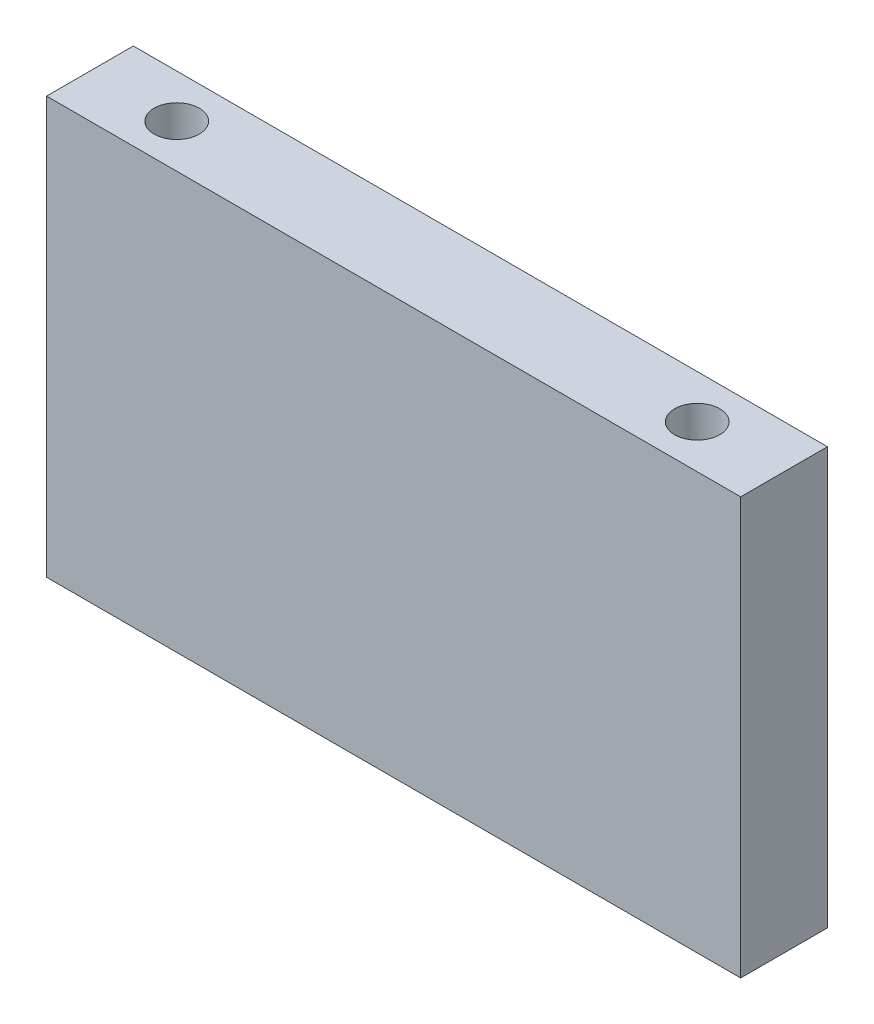
ISO-10303-21;
HEADER;
FILE_DESCRIPTION(('STEP AP214'),'2;1');
FILE_NAME('part.step','',(''),(''),'','','');
FILE_SCHEMA(('AUTOMOTIVE_DESIGN { 1 0 10303 214 1 1 1 1 }'));
ENDSEC;
DATA;
#1=APPLICATION_CONTEXT('core data for automotive mechanical design processes');
#2=APPLICATION_PROTOCOL_DEFINITION('international standard','automotive_design',2000,#1);
#3=PRODUCT_CONTEXT('',#1,'mechanical');
#4=PRODUCT('Part','Part','',(#3));
#5=PRODUCT_RELATED_PRODUCT_CATEGORY('part','',(#4));
#6=PRODUCT_DEFINITION_FORMATION('','',#4);
#7=PRODUCT_DEFINITION_CONTEXT('part definition',#1,'design');
#8=PRODUCT_DEFINITION('design','',#6,#7);
#9=PRODUCT_DEFINITION_SHAPE('','',#8);
#10=(LENGTH_UNIT() NAMED_UNIT(*) SI_UNIT(.MILLI.,.METRE.));
#11=(NAMED_UNIT(*) PLANE_ANGLE_UNIT() SI_UNIT($,.RADIAN.));
#12=(NAMED_UNIT(*) SI_UNIT($,.STERADIAN.) SOLID_ANGLE_UNIT());
#13=UNCERTAINTY_MEASURE_WITH_UNIT(LENGTH_MEASURE(1.E-05),#10,'distance_accuracy_value','');
#14=(GEOMETRIC_REPRESENTATION_CONTEXT(3) GLOBAL_UNCERTAINTY_ASSIGNED_CONTEXT((#13)) GLOBAL_UNIT_ASSIGNED_CONTEXT((#10,
#11,#12)) REPRESENTATION_CONTEXT('',''));
#15=CARTESIAN_POINT('',(0.,0.,0.));
#16=DIRECTION('',(0.,0.,1.));
#17=DIRECTION('',(1.,0.,0.));
#18=AXIS2_PLACEMENT_3D('',#15,#16,#17);
#19=CARTESIAN_POINT('',(0.,0.,6.35));
#20=DIRECTION('',(1.,0.,0.));
#21=DIRECTION('',(0.,0.,-1.));
#22=AXIS2_PLACEMENT_3D('',#19,#20,#21);
#23=PLANE('',#22);
#24=DIRECTION('',(0.,-1.,0.));
#25=VECTOR('',#24,1.);
#26=CARTESIAN_POINT('',(0.,0.,0.));
#27=LINE('',#26,#25);
#28=CARTESIAN_POINT('',(0.,30.5,0.));
#29=VERTEX_POINT('',#28);
#30=CARTESIAN_POINT('',(0.,0.,0.));
#31=VERTEX_POINT('',#30);
#32=EDGE_CURVE('E98',#29,#31,#27,.T.);
#33=ORIENTED_EDGE('',*,*,#32,.T.);
#34=DIRECTION('',(0.,0.,-1.));
#35=VECTOR('',#34,1.);
#36=CARTESIAN_POINT('',(0.,0.,6.35));
#37=LINE('',#36,#35);
#38=CARTESIAN_POINT('',(0.,0.,6.35));
#39=VERTEX_POINT('',#38);
#40=EDGE_CURVE('E11',#39,#31,#37,.T.);
#41=ORIENTED_EDGE('',*,*,#40,.F.);
#42=DIRECTION('',(0.,-1.,0.));
#43=VECTOR('',#42,1.);
#44=CARTESIAN_POINT('',(0.,0.,6.35));
#45=LINE('',#44,#43);
#46=CARTESIAN_POINT('',(0.,30.5,6.35));
#47=VERTEX_POINT('',#46);
#48=EDGE_CURVE('E86',#47,#39,#45,.T.);
#49=ORIENTED_EDGE('',*,*,#48,.F.);
#50=DIRECTION('',(0.,0.,-1.));
#51=VECTOR('',#50,1.);
#52=CARTESIAN_POINT('',(0.,30.5,6.35));
#53=LINE('',#52,#51);
#54=EDGE_CURVE('E94',#47,#29,#53,.T.);
#55=ORIENTED_EDGE('',*,*,#54,.T.);
#56=EDGE_LOOP('',(#33,#41,#49,#55));
#57=FACE_BOUND('',#56,.T.);
#58=ADVANCED_FACE('F35',(#57),#23,.F.);
#59=CARTESIAN_POINT('',(0.,0.,6.35));
#60=DIRECTION('',(0.,1.,0.));
#61=DIRECTION('',(0.,0.,1.));
#62=AXIS2_PLACEMENT_3D('',#59,#60,#61);
#63=PLANE('',#62);
#64=CARTESIAN_POINT('',(6.35,0.,3.175));
#65=DIRECTION('',(0.,1.,0.));
#66=DIRECTION('',(0.,0.,1.));
#67=AXIS2_PLACEMENT_3D('',#64,#65,#66);
#68=CIRCLE('',#67,1.65);
#69=CARTESIAN_POINT('',(6.35,0.,4.82499999999999));
#70=VERTEX_POINT('',#69);
#71=EDGE_CURVE('E117',#70,#70,#68,.T.);
#72=ORIENTED_EDGE('',*,*,#71,.T.);
#73=EDGE_LOOP('',(#72));
#74=FACE_BOUND('',#73,.T.);
#75=CARTESIAN_POINT('',(44.449999381277,0.,3.18186634489615));
#76=DIRECTION('',(0.,1.,0.));
#77=DIRECTION('',(0.,0.,1.));
#78=AXIS2_PLACEMENT_3D('',#75,#76,#77);
#79=CIRCLE('',#78,1.64999999999999);
#80=CARTESIAN_POINT('',(44.449999381277,0.,4.83186634489615));
#81=VERTEX_POINT('',#80);
#82=EDGE_CURVE('E101',#81,#81,#79,.T.);
#83=ORIENTED_EDGE('',*,*,#82,.T.);
#84=EDGE_LOOP('',(#83));
#85=FACE_BOUND('',#84,.T.);
#86=DIRECTION('',(1.,0.,0.));
#87=VECTOR('',#86,1.);
#88=CARTESIAN_POINT('',(0.,0.,0.));
#89=LINE('',#88,#87);
#90=CARTESIAN_POINT('',(50.8,0.,0.));
#91=VERTEX_POINT('',#90);
#92=EDGE_CURVE('E90',#31,#91,#89,.T.);
#93=ORIENTED_EDGE('',*,*,#92,.T.);
#94=DIRECTION('',(0.,0.,-1.));
#95=VECTOR('',#94,1.);
#96=CARTESIAN_POINT('',(50.8,0.,6.35));
#97=LINE('',#96,#95);
#98=CARTESIAN_POINT('',(50.8,0.,6.35));
#99=VERTEX_POINT('',#98);
#100=EDGE_CURVE('E43',#99,#91,#97,.T.);
#101=ORIENTED_EDGE('',*,*,#100,.F.);
#102=DIRECTION('',(1.,0.,0.));
#103=VECTOR('',#102,1.);
#104=CARTESIAN_POINT('',(0.,0.,6.35));
#105=LINE('',#104,#103);
#106=EDGE_CURVE('E81',#39,#99,#105,.T.);
#107=ORIENTED_EDGE('',*,*,#106,.F.);
#108=ORIENTED_EDGE('',*,*,#40,.T.);
#109=EDGE_LOOP('',(#93,#101,#107,#108));
#110=FACE_BOUND('',#109,.T.);
#111=ADVANCED_FACE('F89',(#74,#85,#110),#63,.F.);
#112=CARTESIAN_POINT('',(50.8,0.,6.35));
#113=DIRECTION('',(-1.,0.,0.));
#114=DIRECTION('',(0.,0.,1.));
#115=AXIS2_PLACEMENT_3D('',#112,#113,#114);
#116=PLANE('',#115);
#117=DIRECTION('',(0.,1.,0.));
#118=VECTOR('',#117,1.);
#119=CARTESIAN_POINT('',(50.8,0.,0.));
#120=LINE('',#119,#118);
#121=CARTESIAN_POINT('',(50.8,30.5,0.));
#122=VERTEX_POINT('',#121);
#123=EDGE_CURVE('E68',#91,#122,#120,.T.);
#124=ORIENTED_EDGE('',*,*,#123,.T.);
#125=DIRECTION('',(0.,0.,-1.));
#126=VECTOR('',#125,1.);
#127=CARTESIAN_POINT('',(50.8,30.5,6.35));
#128=LINE('',#127,#126);
#129=CARTESIAN_POINT('',(50.8,30.5,6.35));
#130=VERTEX_POINT('',#129);
#131=EDGE_CURVE('E91',#130,#122,#128,.T.);
#132=ORIENTED_EDGE('',*,*,#131,.F.);
#133=DIRECTION('',(0.,1.,0.));
#134=VECTOR('',#133,1.);
#135=CARTESIAN_POINT('',(50.8,0.,6.35));
#136=LINE('',#135,#134);
#137=EDGE_CURVE('E84',#99,#130,#136,.T.);
#138=ORIENTED_EDGE('',*,*,#137,.F.);
#139=ORIENTED_EDGE('',*,*,#100,.T.);
#140=EDGE_LOOP('',(#124,#132,#138,#139));
#141=FACE_BOUND('',#140,.T.);
#142=ADVANCED_FACE('F92',(#141),#116,.F.);
#143=CARTESIAN_POINT('',(0.,30.5,6.35));
#144=DIRECTION('',(0.,-1.,0.));
#145=DIRECTION('',(0.,0.,-1.));
#146=AXIS2_PLACEMENT_3D('',#143,#144,#145);
#147=PLANE('',#146);
#148=CARTESIAN_POINT('',(6.35,30.5,3.175));
#149=DIRECTION('',(0.,1.,0.));
#150=DIRECTION('',(0.,0.,1.));
#151=AXIS2_PLACEMENT_3D('',#148,#149,#150);
#152=CIRCLE('',#151,1.64999999999999);
#153=CARTESIAN_POINT('',(6.35,30.5,4.82499999999999));
#154=VERTEX_POINT('',#153);
#155=EDGE_CURVE('E120',#154,#154,#152,.T.);
#156=ORIENTED_EDGE('',*,*,#155,.F.);
#157=EDGE_LOOP('',(#156));
#158=FACE_BOUND('',#157,.T.);
#159=CARTESIAN_POINT('',(44.449999381277,30.5,3.18186634489615));
#160=DIRECTION('',(0.,1.,0.));
#161=DIRECTION('',(0.,0.,1.));
#162=AXIS2_PLACEMENT_3D('',#159,#160,#161);
#163=CIRCLE('',#162,1.64999999999998);
#164=CARTESIAN_POINT('',(44.449999381277,30.5,4.83186634489614));
#165=VERTEX_POINT('',#164);
#166=EDGE_CURVE('E114',#165,#165,#163,.T.);
#167=ORIENTED_EDGE('',*,*,#166,.F.);
#168=EDGE_LOOP('',(#167));
#169=FACE_BOUND('',#168,.T.);
#170=DIRECTION('',(-1.,0.,0.));
#171=VECTOR('',#170,1.);
#172=CARTESIAN_POINT('',(0.,30.5,0.));
#173=LINE('',#172,#171);
#174=EDGE_CURVE('E74',#122,#29,#173,.T.);
#175=ORIENTED_EDGE('',*,*,#174,.T.);
#176=ORIENTED_EDGE('',*,*,#54,.F.);
#177=DIRECTION('',(-1.,0.,0.));
#178=VECTOR('',#177,1.);
#179=CARTESIAN_POINT('',(0.,30.5,6.35));
#180=LINE('',#179,#178);
#181=EDGE_CURVE('E51',#130,#47,#180,.T.);
#182=ORIENTED_EDGE('',*,*,#181,.F.);
#183=ORIENTED_EDGE('',*,*,#131,.T.);
#184=EDGE_LOOP('',(#175,#176,#182,#183));
#185=FACE_BOUND('',#184,.T.);
#186=ADVANCED_FACE('F106',(#158,#169,#185),#147,.F.);
#187=CARTESIAN_POINT('',(0.,0.,6.35));
#188=DIRECTION('',(0.,0.,-1.));
#189=DIRECTION('',(-1.,0.,0.));
#190=AXIS2_PLACEMENT_3D('',#187,#188,#189);
#191=PLANE('',#190);
#192=ORIENTED_EDGE('',*,*,#48,.T.);
#193=ORIENTED_EDGE('',*,*,#106,.T.);
#194=ORIENTED_EDGE('',*,*,#137,.T.);
#195=ORIENTED_EDGE('',*,*,#181,.T.);
#196=EDGE_LOOP('',(#192,#193,#194,#195));
#197=FACE_BOUND('',#196,.T.);
#198=ADVANCED_FACE('F82',(#197),#191,.F.);
#199=CARTESIAN_POINT('',(0.,0.,0.));
#200=DIRECTION('',(0.,0.,-1.));
#201=DIRECTION('',(-1.,0.,0.));
#202=AXIS2_PLACEMENT_3D('',#199,#200,#201);
#203=PLANE('',#202);
#204=ORIENTED_EDGE('',*,*,#32,.F.);
#205=ORIENTED_EDGE('',*,*,#174,.F.);
#206=ORIENTED_EDGE('',*,*,#123,.F.);
#207=ORIENTED_EDGE('',*,*,#92,.F.);
#208=EDGE_LOOP('',(#204,#205,#206,#207));
#209=FACE_BOUND('',#208,.T.);
#210=ADVANCED_FACE('F109',(#209),#203,.T.);
#211=CARTESIAN_POINT('',(44.449999381277,30.5,3.18186634489615));
#212=DIRECTION('',(0.,1.,0.));
#213=DIRECTION('',(0.,0.,1.));
#214=AXIS2_PLACEMENT_3D('',#211,#212,#213);
#215=CYLINDRICAL_SURFACE('',#214,1.64999999999999);
#216=ORIENTED_EDGE('',*,*,#82,.F.);
#217=EDGE_LOOP('',(#216));
#218=FACE_BOUND('',#217,.T.);
#219=ORIENTED_EDGE('',*,*,#166,.T.);
#220=EDGE_LOOP('',(#219));
#221=FACE_BOUND('',#220,.T.);
#222=ADVANCED_FACE('F131',(#218,#221),#215,.F.);
#223=CARTESIAN_POINT('',(6.35,30.5,3.175));
#224=DIRECTION('',(0.,1.,0.));
#225=DIRECTION('',(0.,0.,1.));
#226=AXIS2_PLACEMENT_3D('',#223,#224,#225);
#227=CYLINDRICAL_SURFACE('',#226,1.64999999999999);
#228=ORIENTED_EDGE('',*,*,#71,.F.);
#229=EDGE_LOOP('',(#228));
#230=FACE_BOUND('',#229,.T.);
#231=ORIENTED_EDGE('',*,*,#155,.T.);
#232=EDGE_LOOP('',(#231));
#233=FACE_BOUND('',#232,.T.);
#234=ADVANCED_FACE('F124',(#230,#233),#227,.F.);
#235=CLOSED_SHELL('',(#58,#111,#142,#186,#198,#210,#222,#234));
#236=MANIFOLD_SOLID_BREP('B2',#235);
#237=ADVANCED_BREP_SHAPE_REPRESENTATION('',(#18,#236),#14);
#238=SHAPE_DEFINITION_REPRESENTATION(#9,#237);
ENDSEC;
END-ISO-10303-21;
